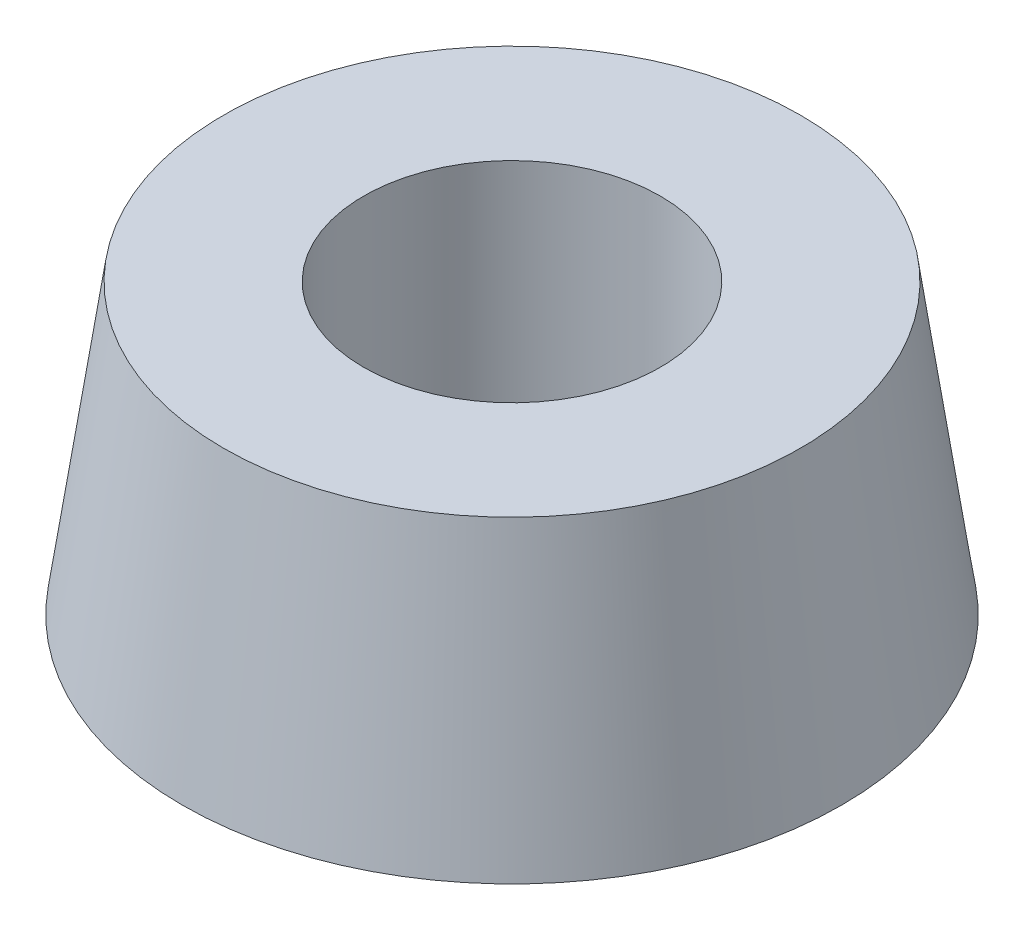
ISO-10303-21;
HEADER;
FILE_DESCRIPTION(('STEP AP214'),'2;1');
FILE_NAME('part.step','',(''),(''),'','','');
FILE_SCHEMA(('AUTOMOTIVE_DESIGN { 1 0 10303 214 1 1 1 1 }'));
ENDSEC;
DATA;
#1=APPLICATION_CONTEXT('core data for automotive mechanical design processes');
#2=APPLICATION_PROTOCOL_DEFINITION('international standard','automotive_design',2000,#1);
#3=PRODUCT_CONTEXT('',#1,'mechanical');
#4=PRODUCT('Part','Part','',(#3));
#5=PRODUCT_RELATED_PRODUCT_CATEGORY('part','',(#4));
#6=PRODUCT_DEFINITION_FORMATION('','',#4);
#7=PRODUCT_DEFINITION_CONTEXT('part definition',#1,'design');
#8=PRODUCT_DEFINITION('design','',#6,#7);
#9=PRODUCT_DEFINITION_SHAPE('','',#8);
#10=(LENGTH_UNIT() NAMED_UNIT(*) SI_UNIT(.MILLI.,.METRE.));
#11=(NAMED_UNIT(*) PLANE_ANGLE_UNIT() SI_UNIT($,.RADIAN.));
#12=(NAMED_UNIT(*) SI_UNIT($,.STERADIAN.) SOLID_ANGLE_UNIT());
#13=UNCERTAINTY_MEASURE_WITH_UNIT(LENGTH_MEASURE(1.E-05),#10,'distance_accuracy_value','');
#14=(GEOMETRIC_REPRESENTATION_CONTEXT(3) GLOBAL_UNCERTAINTY_ASSIGNED_CONTEXT((#13)) GLOBAL_UNIT_ASSIGNED_CONTEXT((#10,
#11,#12)) REPRESENTATION_CONTEXT('',''));
#15=CARTESIAN_POINT('',(0.,0.,0.));
#16=DIRECTION('',(0.,0.,1.));
#17=DIRECTION('',(1.,0.,0.));
#18=AXIS2_PLACEMENT_3D('',#15,#16,#17);
#19=CARTESIAN_POINT('',(0.,10.5,0.));
#20=DIRECTION('',(0.,1.,0.));
#21=DIRECTION('',(0.,0.,1.));
#22=AXIS2_PLACEMENT_3D('',#19,#20,#21);
#23=PLANE('',#22);
#24=CARTESIAN_POINT('',(0.,10.5,0.));
#25=DIRECTION('',(0.,1.,0.));
#26=DIRECTION('',(0.,0.,1.));
#27=AXIS2_PLACEMENT_3D('',#24,#25,#26);
#28=CIRCLE('',#27,5.4);
#29=CARTESIAN_POINT('',(0.,10.5,5.4));
#30=VERTEX_POINT('',#29);
#31=EDGE_CURVE('E103',#30,#30,#28,.T.);
#32=ORIENTED_EDGE('',*,*,#31,.F.);
#33=EDGE_LOOP('',(#32));
#34=FACE_BOUND('',#33,.T.);
#35=CARTESIAN_POINT('',(0.,10.5,0.));
#36=DIRECTION('',(0.,1.,0.));
#37=DIRECTION('',(0.,0.,1.));
#38=AXIS2_PLACEMENT_3D('',#35,#36,#37);
#39=CIRCLE('',#38,10.5);
#40=CARTESIAN_POINT('',(0.,10.5,10.5));
#41=VERTEX_POINT('',#40);
#42=EDGE_CURVE('E43',#41,#41,#39,.T.);
#43=ORIENTED_EDGE('',*,*,#42,.T.);
#44=EDGE_LOOP('',(#43));
#45=FACE_BOUND('',#44,.T.);
#46=ADVANCED_FACE('F35',(#34,#45),#23,.T.);
#47=CARTESIAN_POINT('',(0.,0.,0.));
#48=DIRECTION('',(0.,1.,0.));
#49=DIRECTION('',(0.,0.,1.));
#50=AXIS2_PLACEMENT_3D('',#47,#48,#49);
#51=PLANE('',#50);
#52=CARTESIAN_POINT('',(0.,0.,0.));
#53=DIRECTION('',(0.,1.,0.));
#54=DIRECTION('',(0.,0.,1.));
#55=AXIS2_PLACEMENT_3D('',#52,#53,#54);
#56=CIRCLE('',#55,5.4);
#57=CARTESIAN_POINT('',(0.,0.,5.4));
#58=VERTEX_POINT('',#57);
#59=EDGE_CURVE('E39',#58,#58,#56,.T.);
#60=ORIENTED_EDGE('',*,*,#59,.T.);
#61=EDGE_LOOP('',(#60));
#62=FACE_BOUND('',#61,.T.);
#63=CARTESIAN_POINT('',(0.,0.,0.));
#64=DIRECTION('',(0.,1.,0.));
#65=DIRECTION('',(0.,0.,1.));
#66=AXIS2_PLACEMENT_3D('',#63,#64,#65);
#67=CIRCLE('',#66,12.);
#68=CARTESIAN_POINT('',(0.,0.,12.));
#69=VERTEX_POINT('',#68);
#70=EDGE_CURVE('E11',#69,#69,#67,.T.);
#71=ORIENTED_EDGE('',*,*,#70,.F.);
#72=EDGE_LOOP('',(#71));
#73=FACE_BOUND('',#72,.T.);
#74=ADVANCED_FACE('F86',(#62,#73),#51,.F.);
#75=CARTESIAN_POINT('',(0.,10.5,0.));
#76=DIRECTION('',(0.,-1.,0.));
#77=DIRECTION('',(0.,0.,-1.));
#78=AXIS2_PLACEMENT_3D('',#75,#76,#77);
#79=CONICAL_SURFACE('',#78,10.5,0.141897054604164);
#80=ORIENTED_EDGE('',*,*,#70,.T.);
#81=EDGE_LOOP('',(#80));
#82=FACE_BOUND('',#81,.T.);
#83=ORIENTED_EDGE('',*,*,#42,.F.);
#84=EDGE_LOOP('',(#83));
#85=FACE_BOUND('',#84,.T.);
#86=ADVANCED_FACE('F71',(#82,#85),#79,.T.);
#87=CARTESIAN_POINT('',(0.,-9.99999999994061E-05,0.));
#88=DIRECTION('',(0.,1.,0.));
#89=DIRECTION('',(0.,0.,1.));
#90=AXIS2_PLACEMENT_3D('',#87,#88,#89);
#91=CYLINDRICAL_SURFACE('',#90,5.4);
#92=CARTESIAN_POINT('',(0.,10.5,5.4));
#93=CARTESIAN_POINT('',(0.,10.390625,5.4));
#94=CARTESIAN_POINT('',(0.,10.28125,5.4));
#95=CARTESIAN_POINT('',(0.,10.0625,5.4));
#96=CARTESIAN_POINT('',(0.,9.953125,5.4));
#97=CARTESIAN_POINT('',(0.,9.734375,5.4));
#98=CARTESIAN_POINT('',(0.,9.625,5.4));
#99=CARTESIAN_POINT('',(0.,9.40625,5.4));
#100=CARTESIAN_POINT('',(0.,9.296875,5.4));
#101=CARTESIAN_POINT('',(0.,9.078125,5.4));
#102=CARTESIAN_POINT('',(0.,8.96875,5.4));
#103=CARTESIAN_POINT('',(0.,8.75,5.4));
#104=CARTESIAN_POINT('',(0.,8.640625,5.4));
#105=CARTESIAN_POINT('',(0.,8.421875,5.4));
#106=CARTESIAN_POINT('',(0.,8.3125,5.4));
#107=CARTESIAN_POINT('',(0.,8.09375,5.4));
#108=CARTESIAN_POINT('',(0.,7.984375,5.4));
#109=CARTESIAN_POINT('',(0.,7.765625,5.4));
#110=CARTESIAN_POINT('',(0.,7.65625,5.4));
#111=CARTESIAN_POINT('',(0.,7.4375,5.4));
#112=CARTESIAN_POINT('',(0.,7.328125,5.4));
#113=CARTESIAN_POINT('',(0.,7.109375,5.4));
#114=CARTESIAN_POINT('',(0.,7.,5.4));
#115=CARTESIAN_POINT('',(0.,6.78125,5.4));
#116=CARTESIAN_POINT('',(0.,6.671875,5.4));
#117=CARTESIAN_POINT('',(0.,6.453125,5.4));
#118=CARTESIAN_POINT('',(0.,6.34375,5.4));
#119=CARTESIAN_POINT('',(0.,6.125,5.4));
#120=CARTESIAN_POINT('',(0.,6.015625,5.4));
#121=CARTESIAN_POINT('',(0.,5.796875,5.4));
#122=CARTESIAN_POINT('',(0.,5.6875,5.4));
#123=CARTESIAN_POINT('',(0.,5.46875,5.4));
#124=CARTESIAN_POINT('',(0.,5.359375,5.4));
#125=CARTESIAN_POINT('',(0.,5.140625,5.4));
#126=CARTESIAN_POINT('',(0.,5.03125,5.4));
#127=CARTESIAN_POINT('',(0.,4.8125,5.4));
#128=CARTESIAN_POINT('',(0.,4.703125,5.4));
#129=CARTESIAN_POINT('',(0.,4.484375,5.4));
#130=CARTESIAN_POINT('',(0.,4.375,5.4));
#131=CARTESIAN_POINT('',(0.,4.15625,5.4));
#132=CARTESIAN_POINT('',(0.,4.046875,5.4));
#133=CARTESIAN_POINT('',(0.,3.828125,5.4));
#134=CARTESIAN_POINT('',(0.,3.71875,5.4));
#135=CARTESIAN_POINT('',(0.,3.5,5.4));
#136=CARTESIAN_POINT('',(0.,3.390625,5.4));
#137=CARTESIAN_POINT('',(0.,3.171875,5.4));
#138=CARTESIAN_POINT('',(0.,3.0625,5.4));
#139=CARTESIAN_POINT('',(0.,2.84375,5.4));
#140=CARTESIAN_POINT('',(0.,2.734375,5.4));
#141=CARTESIAN_POINT('',(0.,2.515625,5.4));
#142=CARTESIAN_POINT('',(0.,2.40625,5.4));
#143=CARTESIAN_POINT('',(0.,2.1875,5.4));
#144=CARTESIAN_POINT('',(0.,2.078125,5.4));
#145=CARTESIAN_POINT('',(0.,1.859375,5.4));
#146=CARTESIAN_POINT('',(0.,1.75,5.4));
#147=CARTESIAN_POINT('',(0.,1.53125,5.4));
#148=CARTESIAN_POINT('',(0.,1.421875,5.4));
#149=CARTESIAN_POINT('',(0.,1.203125,5.4));
#150=CARTESIAN_POINT('',(0.,1.09375,5.4));
#151=CARTESIAN_POINT('',(0.,0.875000000000001,5.4));
#152=CARTESIAN_POINT('',(0.,0.765625,5.4));
#153=CARTESIAN_POINT('',(0.,0.546875,5.4));
#154=CARTESIAN_POINT('',(0.,0.4375,5.4));
#155=CARTESIAN_POINT('',(0.,0.21875,5.4));
#156=CARTESIAN_POINT('',(0.,0.109375,5.4));
#157=CARTESIAN_POINT('',(0.,0.,5.4));
#158=B_SPLINE_CURVE_WITH_KNOTS('',3,(#92,#93,#94,#95,#96,#97,#98,#99,#100,#101,#102,#103,#104,
#105,#106,#107,#108,#109,#110,#111,#112,#113,#114,#115,#116,#117,#118,#119,#120,#121,#122,#123,
#124,#125,#126,#127,#128,#129,#130,#131,#132,#133,#134,#135,#136,#137,#138,#139,#140,#141,#142,
#143,#144,#145,#146,#147,#148,#149,#150,#151,#152,#153,#154,#155,#156,#157),.UNSPECIFIED.,.F.,
.F.,(4,2,2,2,2,2,2,2,2,2,2,2,2,2,2,2,2,2,2,2,2,2,2,2,2,2,2,2,2,2,2,2,4),(0.,0.328125,
0.656250000000001,0.984375000000001,1.3125,1.640625,1.96875,2.296875,2.625,2.953125,3.28125,
3.609375,3.9375,4.265625,4.59375,4.921875,5.25,5.578125,5.90625,6.234375,6.5625,6.890625,
7.21875,7.546875,7.875,8.203125,8.53125,8.859375,9.1875,9.515625,9.84375,10.171875,10.5),.UNSPECIFIED.);
#159=EDGE_CURVE('BSEAM85',#30,#58,#158,.T.);
#160=ORIENTED_EDGE('',*,*,#31,.T.);
#161=ORIENTED_EDGE('',*,*,#59,.F.);
#162=ORIENTED_EDGE('',*,*,#159,.T.);
#163=ORIENTED_EDGE('',*,*,#159,.F.);
#164=EDGE_LOOP('',(#160,#162,#161,#163));
#165=FACE_BOUND('',#164,.T.);
#166=ADVANCED_FACE('F85',(#165),#91,.F.);
#167=CLOSED_SHELL('',(#46,#74,#86,#166));
#168=MANIFOLD_SOLID_BREP('B2',#167);
#169=ADVANCED_BREP_SHAPE_REPRESENTATION('',(#18,#168),#14);
#170=SHAPE_DEFINITION_REPRESENTATION(#9,#169);
ENDSEC;
END-ISO-10303-21;
